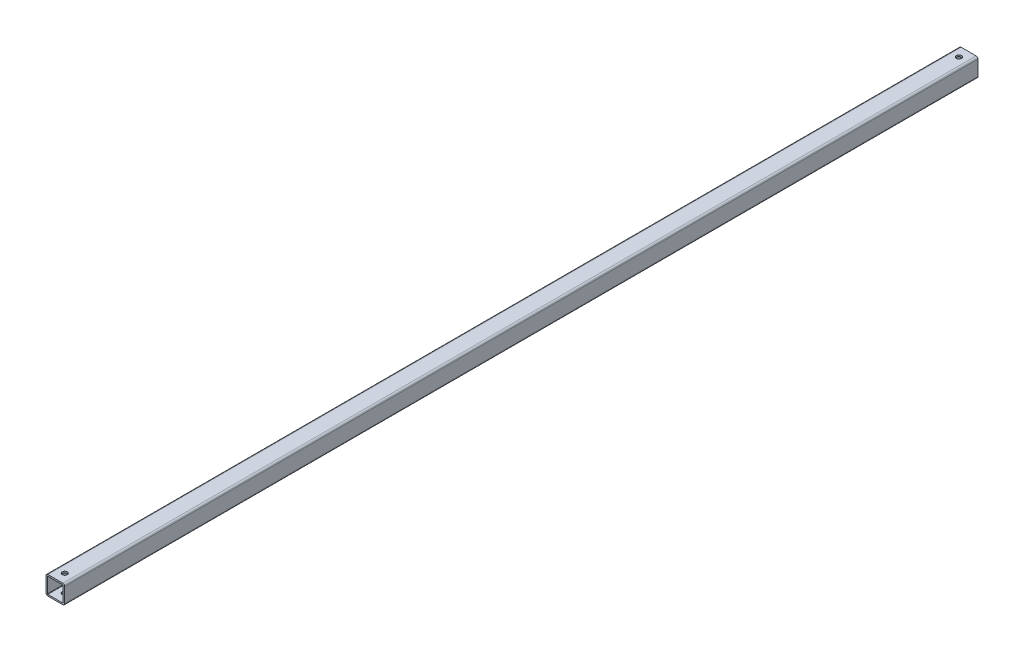
ISO-10303-21;
HEADER;
FILE_DESCRIPTION(('STEP AP214'),'2;1');
FILE_NAME('part.step','',(''),(''),'','','');
FILE_SCHEMA(('AUTOMOTIVE_DESIGN { 1 0 10303 214 1 1 1 1 }'));
ENDSEC;
DATA;
#1=APPLICATION_CONTEXT('core data for automotive mechanical design processes');
#2=APPLICATION_PROTOCOL_DEFINITION('international standard','automotive_design',2000,#1);
#3=PRODUCT_CONTEXT('',#1,'mechanical');
#4=PRODUCT('Part','Part','',(#3));
#5=PRODUCT_RELATED_PRODUCT_CATEGORY('part','',(#4));
#6=PRODUCT_DEFINITION_FORMATION('','',#4);
#7=PRODUCT_DEFINITION_CONTEXT('part definition',#1,'design');
#8=PRODUCT_DEFINITION('design','',#6,#7);
#9=PRODUCT_DEFINITION_SHAPE('','',#8);
#10=(LENGTH_UNIT() NAMED_UNIT(*) SI_UNIT(.MILLI.,.METRE.));
#11=(NAMED_UNIT(*) PLANE_ANGLE_UNIT() SI_UNIT($,.RADIAN.));
#12=(NAMED_UNIT(*) SI_UNIT($,.STERADIAN.) SOLID_ANGLE_UNIT());
#13=UNCERTAINTY_MEASURE_WITH_UNIT(LENGTH_MEASURE(1.E-05),#10,'distance_accuracy_value','');
#14=(GEOMETRIC_REPRESENTATION_CONTEXT(3) GLOBAL_UNCERTAINTY_ASSIGNED_CONTEXT((#13)) GLOBAL_UNIT_ASSIGNED_CONTEXT((#10,
#11,#12)) REPRESENTATION_CONTEXT('',''));
#15=CARTESIAN_POINT('',(0.,0.,0.));
#16=DIRECTION('',(0.,0.,1.));
#17=DIRECTION('',(1.,0.,0.));
#18=AXIS2_PLACEMENT_3D('',#15,#16,#17);
#19=CARTESIAN_POINT('',(-10.,10.,609.6));
#20=DIRECTION('',(0.,0.,1.));
#21=DIRECTION('',(1.,0.,0.));
#22=AXIS2_PLACEMENT_3D('',#19,#20,#21);
#23=PLANE('',#22);
#24=CARTESIAN_POINT('',(-10.,10.,609.6));
#25=DIRECTION('',(0.,0.,1.));
#26=DIRECTION('',(1.,0.,0.));
#27=AXIS2_PLACEMENT_3D('',#24,#25,#26);
#28=CIRCLE('',#27,2.5);
#29=CARTESIAN_POINT('',(-10.,12.5,609.6));
#30=VERTEX_POINT('',#29);
#31=CARTESIAN_POINT('',(-12.5,10.,609.6));
#32=VERTEX_POINT('',#31);
#33=EDGE_CURVE('E264',#30,#32,#28,.T.);
#34=ORIENTED_EDGE('',*,*,#33,.T.);
#35=DIRECTION('',(0.,-1.,0.));
#36=VECTOR('',#35,1.);
#37=CARTESIAN_POINT('',(-12.5,-10.,609.6));
#38=LINE('',#37,#36);
#39=CARTESIAN_POINT('',(-12.5,-10.,609.6));
#40=VERTEX_POINT('',#39);
#41=EDGE_CURVE('E267',#32,#40,#38,.T.);
#42=ORIENTED_EDGE('',*,*,#41,.T.);
#43=CARTESIAN_POINT('',(-10.,-10.,609.6));
#44=DIRECTION('',(0.,0.,1.));
#45=DIRECTION('',(-1.,0.,0.));
#46=AXIS2_PLACEMENT_3D('',#43,#44,#45);
#47=CIRCLE('',#46,2.5);
#48=CARTESIAN_POINT('',(-10.,-12.5,609.6));
#49=VERTEX_POINT('',#48);
#50=EDGE_CURVE('E270',#40,#49,#47,.T.);
#51=ORIENTED_EDGE('',*,*,#50,.T.);
#52=DIRECTION('',(1.,0.,0.));
#53=VECTOR('',#52,1.);
#54=CARTESIAN_POINT('',(10.,-12.5,609.6));
#55=LINE('',#54,#53);
#56=CARTESIAN_POINT('',(10.,-12.5,609.6));
#57=VERTEX_POINT('',#56);
#58=EDGE_CURVE('E272',#49,#57,#55,.T.);
#59=ORIENTED_EDGE('',*,*,#58,.T.);
#60=CARTESIAN_POINT('',(10.,-10.,609.6));
#61=DIRECTION('',(0.,0.,1.));
#62=DIRECTION('',(1.,0.,0.));
#63=AXIS2_PLACEMENT_3D('',#60,#61,#62);
#64=CIRCLE('',#63,2.5);
#65=CARTESIAN_POINT('',(12.5,-10.,609.6));
#66=VERTEX_POINT('',#65);
#67=EDGE_CURVE('E274',#57,#66,#64,.T.);
#68=ORIENTED_EDGE('',*,*,#67,.T.);
#69=DIRECTION('',(0.,1.,0.));
#70=VECTOR('',#69,1.);
#71=CARTESIAN_POINT('',(12.5,-10.,609.6));
#72=LINE('',#71,#70);
#73=CARTESIAN_POINT('',(12.5,10.,609.6));
#74=VERTEX_POINT('',#73);
#75=EDGE_CURVE('E276',#66,#74,#72,.T.);
#76=ORIENTED_EDGE('',*,*,#75,.T.);
#77=CARTESIAN_POINT('',(10.,10.,609.6));
#78=DIRECTION('',(0.,0.,1.));
#79=DIRECTION('',(1.,0.,0.));
#80=AXIS2_PLACEMENT_3D('',#77,#78,#79);
#81=CIRCLE('',#80,2.5);
#82=CARTESIAN_POINT('',(10.,12.5,609.6));
#83=VERTEX_POINT('',#82);
#84=EDGE_CURVE('E278',#74,#83,#81,.T.);
#85=ORIENTED_EDGE('',*,*,#84,.T.);
#86=DIRECTION('',(-1.,0.,0.));
#87=VECTOR('',#86,1.);
#88=CARTESIAN_POINT('',(10.,12.5,609.6));
#89=LINE('',#88,#87);
#90=EDGE_CURVE('E280',#83,#30,#89,.T.);
#91=ORIENTED_EDGE('',*,*,#90,.T.);
#92=EDGE_LOOP('',(#34,#42,#51,#59,#68,#76,#85,#91));
#93=FACE_BOUND('',#92,.T.);
#94=DIRECTION('',(0.,-1.,0.));
#95=VECTOR('',#94,1.);
#96=CARTESIAN_POINT('',(-10.5,-10.,609.6));
#97=LINE('',#96,#95);
#98=CARTESIAN_POINT('',(-10.5,10.,609.6));
#99=VERTEX_POINT('',#98);
#100=CARTESIAN_POINT('',(-10.5,-10.,609.6));
#101=VERTEX_POINT('',#100);
#102=EDGE_CURVE('E205',#99,#101,#97,.T.);
#103=ORIENTED_EDGE('',*,*,#102,.F.);
#104=CARTESIAN_POINT('',(-10.,10.,609.6));
#105=DIRECTION('',(0.,0.,1.));
#106=DIRECTION('',(1.,0.,0.));
#107=AXIS2_PLACEMENT_3D('',#104,#105,#106);
#108=CIRCLE('',#107,0.5);
#109=CARTESIAN_POINT('',(-10.,10.5,609.6));
#110=VERTEX_POINT('',#109);
#111=EDGE_CURVE('E197',#110,#99,#108,.T.);
#112=ORIENTED_EDGE('',*,*,#111,.F.);
#113=DIRECTION('',(-1.,0.,0.));
#114=VECTOR('',#113,1.);
#115=CARTESIAN_POINT('',(10.,10.5,609.6));
#116=LINE('',#115,#114);
#117=CARTESIAN_POINT('',(10.,10.5,609.6));
#118=VERTEX_POINT('',#117);
#119=EDGE_CURVE('E231',#118,#110,#116,.T.);
#120=ORIENTED_EDGE('',*,*,#119,.F.);
#121=CARTESIAN_POINT('',(10.,10.,609.6));
#122=DIRECTION('',(0.,0.,1.));
#123=DIRECTION('',(1.,0.,0.));
#124=AXIS2_PLACEMENT_3D('',#121,#122,#123);
#125=CIRCLE('',#124,0.499999999999997);
#126=CARTESIAN_POINT('',(10.5,10.,609.6));
#127=VERTEX_POINT('',#126);
#128=EDGE_CURVE('E229',#127,#118,#125,.T.);
#129=ORIENTED_EDGE('',*,*,#128,.F.);
#130=DIRECTION('',(0.,1.,0.));
#131=VECTOR('',#130,1.);
#132=CARTESIAN_POINT('',(10.5,-10.,609.6));
#133=LINE('',#132,#131);
#134=CARTESIAN_POINT('',(10.5,-10.,609.6));
#135=VERTEX_POINT('',#134);
#136=EDGE_CURVE('E227',#135,#127,#133,.T.);
#137=ORIENTED_EDGE('',*,*,#136,.F.);
#138=CARTESIAN_POINT('',(10.,-10.,609.6));
#139=DIRECTION('',(0.,0.,1.));
#140=DIRECTION('',(1.,0.,0.));
#141=AXIS2_PLACEMENT_3D('',#138,#139,#140);
#142=CIRCLE('',#141,0.499999999999999);
#143=CARTESIAN_POINT('',(10.,-10.5,609.6));
#144=VERTEX_POINT('',#143);
#145=EDGE_CURVE('E225',#144,#135,#142,.T.);
#146=ORIENTED_EDGE('',*,*,#145,.F.);
#147=DIRECTION('',(1.,0.,0.));
#148=VECTOR('',#147,1.);
#149=CARTESIAN_POINT('',(10.,-10.5,609.6));
#150=LINE('',#149,#148);
#151=CARTESIAN_POINT('',(-10.,-10.5,609.6));
#152=VERTEX_POINT('',#151);
#153=EDGE_CURVE('E220',#152,#144,#150,.T.);
#154=ORIENTED_EDGE('',*,*,#153,.F.);
#155=CARTESIAN_POINT('',(-10.,-10.,609.6));
#156=DIRECTION('',(0.,0.,1.));
#157=DIRECTION('',(1.,0.,0.));
#158=AXIS2_PLACEMENT_3D('',#155,#156,#157);
#159=CIRCLE('',#158,0.500000000000001);
#160=EDGE_CURVE('E218',#101,#152,#159,.T.);
#161=ORIENTED_EDGE('',*,*,#160,.F.);
#162=EDGE_LOOP('',(#103,#112,#120,#129,#137,#146,#154,#161));
#163=FACE_BOUND('',#162,.T.);
#164=ADVANCED_FACE('F82',(#93,#163),#23,.T.);
#165=CARTESIAN_POINT('',(-10.,10.,-609.6));
#166=DIRECTION('',(0.,0.,1.));
#167=DIRECTION('',(1.,0.,0.));
#168=AXIS2_PLACEMENT_3D('',#165,#166,#167);
#169=PLANE('',#168);
#170=CARTESIAN_POINT('',(-10.,10.,-609.6));
#171=DIRECTION('',(0.,0.,1.));
#172=DIRECTION('',(1.,0.,0.));
#173=AXIS2_PLACEMENT_3D('',#170,#171,#172);
#174=CIRCLE('',#173,2.5);
#175=CARTESIAN_POINT('',(-10.,12.5,-609.6));
#176=VERTEX_POINT('',#175);
#177=CARTESIAN_POINT('',(-12.5,10.,-609.6));
#178=VERTEX_POINT('',#177);
#179=EDGE_CURVE('E213',#176,#178,#174,.T.);
#180=ORIENTED_EDGE('',*,*,#179,.F.);
#181=DIRECTION('',(-1.,0.,0.));
#182=VECTOR('',#181,1.);
#183=CARTESIAN_POINT('',(10.,12.5,-609.6));
#184=LINE('',#183,#182);
#185=CARTESIAN_POINT('',(10.,12.5,-609.6));
#186=VERTEX_POINT('',#185);
#187=EDGE_CURVE('E268',#186,#176,#184,.T.);
#188=ORIENTED_EDGE('',*,*,#187,.F.);
#189=CARTESIAN_POINT('',(10.,10.,-609.6));
#190=DIRECTION('',(0.,0.,1.));
#191=DIRECTION('',(1.,0.,0.));
#192=AXIS2_PLACEMENT_3D('',#189,#190,#191);
#193=CIRCLE('',#192,2.5);
#194=CARTESIAN_POINT('',(12.5,10.,-609.6));
#195=VERTEX_POINT('',#194);
#196=EDGE_CURVE('E295',#195,#186,#193,.T.);
#197=ORIENTED_EDGE('',*,*,#196,.F.);
#198=DIRECTION('',(0.,1.,0.));
#199=VECTOR('',#198,1.);
#200=CARTESIAN_POINT('',(12.5,-10.,-609.6));
#201=LINE('',#200,#199);
#202=CARTESIAN_POINT('',(12.5,-10.,-609.6));
#203=VERTEX_POINT('',#202);
#204=EDGE_CURVE('E293',#203,#195,#201,.T.);
#205=ORIENTED_EDGE('',*,*,#204,.F.);
#206=CARTESIAN_POINT('',(10.,-10.,-609.6));
#207=DIRECTION('',(0.,0.,1.));
#208=DIRECTION('',(1.,0.,0.));
#209=AXIS2_PLACEMENT_3D('',#206,#207,#208);
#210=CIRCLE('',#209,2.5);
#211=CARTESIAN_POINT('',(10.,-12.5,-609.6));
#212=VERTEX_POINT('',#211);
#213=EDGE_CURVE('E291',#212,#203,#210,.T.);
#214=ORIENTED_EDGE('',*,*,#213,.F.);
#215=DIRECTION('',(1.,0.,0.));
#216=VECTOR('',#215,1.);
#217=CARTESIAN_POINT('',(10.,-12.5,-609.6));
#218=LINE('',#217,#216);
#219=CARTESIAN_POINT('',(-10.,-12.5,-609.6));
#220=VERTEX_POINT('',#219);
#221=EDGE_CURVE('E289',#220,#212,#218,.T.);
#222=ORIENTED_EDGE('',*,*,#221,.F.);
#223=CARTESIAN_POINT('',(-10.,-10.,-609.6));
#224=DIRECTION('',(0.,0.,1.));
#225=DIRECTION('',(-1.,0.,0.));
#226=AXIS2_PLACEMENT_3D('',#223,#224,#225);
#227=CIRCLE('',#226,2.5);
#228=CARTESIAN_POINT('',(-12.5,-10.,-609.6));
#229=VERTEX_POINT('',#228);
#230=EDGE_CURVE('E287',#229,#220,#227,.T.);
#231=ORIENTED_EDGE('',*,*,#230,.F.);
#232=DIRECTION('',(0.,-1.,0.));
#233=VECTOR('',#232,1.);
#234=CARTESIAN_POINT('',(-12.5,-10.,-609.6));
#235=LINE('',#234,#233);
#236=EDGE_CURVE('E285',#178,#229,#235,.T.);
#237=ORIENTED_EDGE('',*,*,#236,.F.);
#238=EDGE_LOOP('',(#180,#188,#197,#205,#214,#222,#231,#237));
#239=FACE_BOUND('',#238,.T.);
#240=CARTESIAN_POINT('',(-10.,10.,-609.6));
#241=DIRECTION('',(0.,0.,1.));
#242=DIRECTION('',(1.,0.,0.));
#243=AXIS2_PLACEMENT_3D('',#240,#241,#242);
#244=CIRCLE('',#243,0.5);
#245=CARTESIAN_POINT('',(-10.,10.5,-609.6));
#246=VERTEX_POINT('',#245);
#247=CARTESIAN_POINT('',(-10.5,10.,-609.6));
#248=VERTEX_POINT('',#247);
#249=EDGE_CURVE('E107',#246,#248,#244,.T.);
#250=ORIENTED_EDGE('',*,*,#249,.T.);
#251=DIRECTION('',(0.,-1.,0.));
#252=VECTOR('',#251,1.);
#253=CARTESIAN_POINT('',(-10.5,-10.,-609.6));
#254=LINE('',#253,#252);
#255=CARTESIAN_POINT('',(-10.5,-10.,-609.6));
#256=VERTEX_POINT('',#255);
#257=EDGE_CURVE('E212',#248,#256,#254,.T.);
#258=ORIENTED_EDGE('',*,*,#257,.T.);
#259=CARTESIAN_POINT('',(-10.,-10.,-609.6));
#260=DIRECTION('',(0.,0.,1.));
#261=DIRECTION('',(1.,0.,0.));
#262=AXIS2_PLACEMENT_3D('',#259,#260,#261);
#263=CIRCLE('',#262,0.500000000000001);
#264=CARTESIAN_POINT('',(-10.,-10.5,-609.6));
#265=VERTEX_POINT('',#264);
#266=EDGE_CURVE('E236',#256,#265,#263,.T.);
#267=ORIENTED_EDGE('',*,*,#266,.T.);
#268=DIRECTION('',(1.,0.,0.));
#269=VECTOR('',#268,1.);
#270=CARTESIAN_POINT('',(10.,-10.5,-609.6));
#271=LINE('',#270,#269);
#272=CARTESIAN_POINT('',(10.,-10.5,-609.6));
#273=VERTEX_POINT('',#272);
#274=EDGE_CURVE('E239',#265,#273,#271,.T.);
#275=ORIENTED_EDGE('',*,*,#274,.T.);
#276=CARTESIAN_POINT('',(10.,-10.,-609.6));
#277=DIRECTION('',(0.,0.,1.));
#278=DIRECTION('',(1.,0.,0.));
#279=AXIS2_PLACEMENT_3D('',#276,#277,#278);
#280=CIRCLE('',#279,0.499999999999999);
#281=CARTESIAN_POINT('',(10.5,-10.,-609.6));
#282=VERTEX_POINT('',#281);
#283=EDGE_CURVE('E242',#273,#282,#280,.T.);
#284=ORIENTED_EDGE('',*,*,#283,.T.);
#285=DIRECTION('',(0.,1.,0.));
#286=VECTOR('',#285,1.);
#287=CARTESIAN_POINT('',(10.5,-10.,-609.6));
#288=LINE('',#287,#286);
#289=CARTESIAN_POINT('',(10.5,10.,-609.6));
#290=VERTEX_POINT('',#289);
#291=EDGE_CURVE('E245',#282,#290,#288,.T.);
#292=ORIENTED_EDGE('',*,*,#291,.T.);
#293=CARTESIAN_POINT('',(10.,10.,-609.6));
#294=DIRECTION('',(0.,0.,1.));
#295=DIRECTION('',(1.,0.,0.));
#296=AXIS2_PLACEMENT_3D('',#293,#294,#295);
#297=CIRCLE('',#296,0.499999999999997);
#298=CARTESIAN_POINT('',(10.,10.5,-609.6));
#299=VERTEX_POINT('',#298);
#300=EDGE_CURVE('E248',#290,#299,#297,.T.);
#301=ORIENTED_EDGE('',*,*,#300,.T.);
#302=DIRECTION('',(-1.,0.,0.));
#303=VECTOR('',#302,1.);
#304=CARTESIAN_POINT('',(10.,10.5,-609.6));
#305=LINE('',#304,#303);
#306=EDGE_CURVE('E206',#299,#246,#305,.T.);
#307=ORIENTED_EDGE('',*,*,#306,.T.);
#308=EDGE_LOOP('',(#250,#258,#267,#275,#284,#292,#301,#307));
#309=FACE_BOUND('',#308,.T.);
#310=ADVANCED_FACE('F355',(#239,#309),#169,.F.);
#311=CARTESIAN_POINT('',(-10.,10.,609.6));
#312=DIRECTION('',(0.,0.,-1.));
#313=DIRECTION('',(-1.,0.,0.));
#314=AXIS2_PLACEMENT_3D('',#311,#312,#313);
#315=CYLINDRICAL_SURFACE('',#314,2.5);
#316=ORIENTED_EDGE('',*,*,#179,.T.);
#317=DIRECTION('',(0.,0.,-1.));
#318=VECTOR('',#317,1.);
#319=CARTESIAN_POINT('',(-12.5,10.,609.6));
#320=LINE('',#319,#318);
#321=EDGE_CURVE('E12',#32,#178,#320,.T.);
#322=ORIENTED_EDGE('',*,*,#321,.F.);
#323=ORIENTED_EDGE('',*,*,#33,.F.);
#324=DIRECTION('',(0.,0.,-1.));
#325=VECTOR('',#324,1.);
#326=CARTESIAN_POINT('',(-10.,12.5,609.6));
#327=LINE('',#326,#325);
#328=EDGE_CURVE('E282',#30,#176,#327,.T.);
#329=ORIENTED_EDGE('',*,*,#328,.T.);
#330=EDGE_LOOP('',(#316,#322,#323,#329));
#331=FACE_BOUND('',#330,.T.);
#332=ADVANCED_FACE('F84',(#331),#315,.T.);
#333=CARTESIAN_POINT('',(-12.5,-10.,609.6));
#334=DIRECTION('',(1.,0.,0.));
#335=DIRECTION('',(0.,0.,-1.));
#336=AXIS2_PLACEMENT_3D('',#333,#334,#335);
#337=PLANE('',#336);
#338=ORIENTED_EDGE('',*,*,#236,.T.);
#339=DIRECTION('',(0.,0.,-1.));
#340=VECTOR('',#339,1.);
#341=CARTESIAN_POINT('',(-12.5,-10.,609.6));
#342=LINE('',#341,#340);
#343=EDGE_CURVE('E91',#40,#229,#342,.T.);
#344=ORIENTED_EDGE('',*,*,#343,.F.);
#345=ORIENTED_EDGE('',*,*,#41,.F.);
#346=ORIENTED_EDGE('',*,*,#321,.T.);
#347=EDGE_LOOP('',(#338,#344,#345,#346));
#348=FACE_BOUND('',#347,.T.);
#349=ADVANCED_FACE('F387',(#348),#337,.F.);
#350=CARTESIAN_POINT('',(-10.,-10.,609.6));
#351=DIRECTION('',(0.,0.,-1.));
#352=DIRECTION('',(-1.,0.,0.));
#353=AXIS2_PLACEMENT_3D('',#350,#351,#352);
#354=CYLINDRICAL_SURFACE('',#353,2.5);
#355=ORIENTED_EDGE('',*,*,#230,.T.);
#356=DIRECTION('',(0.,0.,-1.));
#357=VECTOR('',#356,1.);
#358=CARTESIAN_POINT('',(-10.,-12.5,609.6));
#359=LINE('',#358,#357);
#360=EDGE_CURVE('E312',#49,#220,#359,.T.);
#361=ORIENTED_EDGE('',*,*,#360,.F.);
#362=ORIENTED_EDGE('',*,*,#50,.F.);
#363=ORIENTED_EDGE('',*,*,#343,.T.);
#364=EDGE_LOOP('',(#355,#361,#362,#363));
#365=FACE_BOUND('',#364,.T.);
#366=ADVANCED_FACE('F384',(#365),#354,.T.);
#367=CARTESIAN_POINT('',(10.,-12.5,609.6));
#368=DIRECTION('',(0.,1.,0.));
#369=DIRECTION('',(-1.,0.,0.));
#370=AXIS2_PLACEMENT_3D('',#367,#368,#369);
#371=PLANE('',#370);
#372=CARTESIAN_POINT('',(-0.200000000000002,-12.5,-596.9));
#373=DIRECTION('',(0.,1.,0.));
#374=DIRECTION('',(-1.,0.,0.));
#375=AXIS2_PLACEMENT_3D('',#372,#373,#374);
#376=CIRCLE('',#375,3.3782);
#377=CARTESIAN_POINT('',(-0.200000000000002,-12.5,-593.5218));
#378=VERTEX_POINT('',#377);
#379=EDGE_CURVE('E325',#378,#378,#376,.T.);
#380=ORIENTED_EDGE('',*,*,#379,.T.);
#381=EDGE_LOOP('',(#380));
#382=FACE_BOUND('',#381,.T.);
#383=CARTESIAN_POINT('',(-0.200000000000002,-12.5,596.9));
#384=DIRECTION('',(0.,1.,0.));
#385=DIRECTION('',(-1.,0.,0.));
#386=AXIS2_PLACEMENT_3D('',#383,#384,#385);
#387=CIRCLE('',#386,3.3782);
#388=CARTESIAN_POINT('',(-0.200000000000002,-12.5,600.2782));
#389=VERTEX_POINT('',#388);
#390=EDGE_CURVE('E234',#389,#389,#387,.T.);
#391=ORIENTED_EDGE('',*,*,#390,.T.);
#392=EDGE_LOOP('',(#391));
#393=FACE_BOUND('',#392,.T.);
#394=ORIENTED_EDGE('',*,*,#221,.T.);
#395=DIRECTION('',(0.,0.,-1.));
#396=VECTOR('',#395,1.);
#397=CARTESIAN_POINT('',(10.,-12.5,609.6));
#398=LINE('',#397,#396);
#399=EDGE_CURVE('E309',#57,#212,#398,.T.);
#400=ORIENTED_EDGE('',*,*,#399,.F.);
#401=ORIENTED_EDGE('',*,*,#58,.F.);
#402=ORIENTED_EDGE('',*,*,#360,.T.);
#403=EDGE_LOOP('',(#394,#400,#401,#402));
#404=FACE_BOUND('',#403,.T.);
#405=ADVANCED_FACE('F336',(#382,#393,#404),#371,.F.);
#406=CARTESIAN_POINT('',(10.,-10.,609.6));
#407=DIRECTION('',(0.,0.,-1.));
#408=DIRECTION('',(-1.,0.,0.));
#409=AXIS2_PLACEMENT_3D('',#406,#407,#408);
#410=CYLINDRICAL_SURFACE('',#409,2.5);
#411=ORIENTED_EDGE('',*,*,#213,.T.);
#412=DIRECTION('',(0.,0.,-1.));
#413=VECTOR('',#412,1.);
#414=CARTESIAN_POINT('',(12.5,-10.,609.6));
#415=LINE('',#414,#413);
#416=EDGE_CURVE('E306',#66,#203,#415,.T.);
#417=ORIENTED_EDGE('',*,*,#416,.F.);
#418=ORIENTED_EDGE('',*,*,#67,.F.);
#419=ORIENTED_EDGE('',*,*,#399,.T.);
#420=EDGE_LOOP('',(#411,#417,#418,#419));
#421=FACE_BOUND('',#420,.T.);
#422=ADVANCED_FACE('F377',(#421),#410,.T.);
#423=CARTESIAN_POINT('',(12.5,-10.,609.6));
#424=DIRECTION('',(-1.,0.,0.));
#425=DIRECTION('',(0.,-1.,0.));
#426=AXIS2_PLACEMENT_3D('',#423,#424,#425);
#427=PLANE('',#426);
#428=ORIENTED_EDGE('',*,*,#204,.T.);
#429=DIRECTION('',(0.,0.,-1.));
#430=VECTOR('',#429,1.);
#431=CARTESIAN_POINT('',(12.5,10.,609.6));
#432=LINE('',#431,#430);
#433=EDGE_CURVE('E303',#74,#195,#432,.T.);
#434=ORIENTED_EDGE('',*,*,#433,.F.);
#435=ORIENTED_EDGE('',*,*,#75,.F.);
#436=ORIENTED_EDGE('',*,*,#416,.T.);
#437=EDGE_LOOP('',(#428,#434,#435,#436));
#438=FACE_BOUND('',#437,.T.);
#439=ADVANCED_FACE('F373',(#438),#427,.F.);
#440=CARTESIAN_POINT('',(10.,10.,609.6));
#441=DIRECTION('',(0.,0.,-1.));
#442=DIRECTION('',(-1.,0.,0.));
#443=AXIS2_PLACEMENT_3D('',#440,#441,#442);
#444=CYLINDRICAL_SURFACE('',#443,2.5);
#445=ORIENTED_EDGE('',*,*,#196,.T.);
#446=DIRECTION('',(0.,0.,-1.));
#447=VECTOR('',#446,1.);
#448=CARTESIAN_POINT('',(10.,12.5,609.6));
#449=LINE('',#448,#447);
#450=EDGE_CURVE('E300',#83,#186,#449,.T.);
#451=ORIENTED_EDGE('',*,*,#450,.F.);
#452=ORIENTED_EDGE('',*,*,#84,.F.);
#453=ORIENTED_EDGE('',*,*,#433,.T.);
#454=EDGE_LOOP('',(#445,#451,#452,#453));
#455=FACE_BOUND('',#454,.T.);
#456=ADVANCED_FACE('F369',(#455),#444,.T.);
#457=CARTESIAN_POINT('',(10.,12.5,609.6));
#458=DIRECTION('',(0.,-1.,0.));
#459=DIRECTION('',(1.,0.,0.));
#460=AXIS2_PLACEMENT_3D('',#457,#458,#459);
#461=PLANE('',#460);
#462=CARTESIAN_POINT('',(-0.200000000000002,12.5,-596.9));
#463=DIRECTION('',(0.,1.,0.));
#464=DIRECTION('',(0.,0.,1.));
#465=AXIS2_PLACEMENT_3D('',#462,#463,#464);
#466=CIRCLE('',#465,3.3782);
#467=CARTESIAN_POINT('',(-0.200000000000002,12.5,-593.5218));
#468=VERTEX_POINT('',#467);
#469=EDGE_CURVE('E464',#468,#468,#466,.T.);
#470=ORIENTED_EDGE('',*,*,#469,.F.);
#471=EDGE_LOOP('',(#470));
#472=FACE_BOUND('',#471,.T.);
#473=CARTESIAN_POINT('',(-0.200000000000002,12.5,596.9));
#474=DIRECTION('',(0.,1.,0.));
#475=DIRECTION('',(0.,0.,1.));
#476=AXIS2_PLACEMENT_3D('',#473,#474,#475);
#477=CIRCLE('',#476,3.3782);
#478=CARTESIAN_POINT('',(-0.200000000000002,12.5,600.2782));
#479=VERTEX_POINT('',#478);
#480=EDGE_CURVE('E319',#479,#479,#477,.T.);
#481=ORIENTED_EDGE('',*,*,#480,.F.);
#482=EDGE_LOOP('',(#481));
#483=FACE_BOUND('',#482,.T.);
#484=ORIENTED_EDGE('',*,*,#187,.T.);
#485=ORIENTED_EDGE('',*,*,#328,.F.);
#486=ORIENTED_EDGE('',*,*,#90,.F.);
#487=ORIENTED_EDGE('',*,*,#450,.T.);
#488=EDGE_LOOP('',(#484,#485,#486,#487));
#489=FACE_BOUND('',#488,.T.);
#490=ADVANCED_FACE('F366',(#472,#483,#489),#461,.F.);
#491=CARTESIAN_POINT('',(-10.,10.,609.6));
#492=DIRECTION('',(0.,0.,-1.));
#493=DIRECTION('',(-1.,0.,0.));
#494=AXIS2_PLACEMENT_3D('',#491,#492,#493);
#495=CYLINDRICAL_SURFACE('',#494,0.5);
#496=ORIENTED_EDGE('',*,*,#249,.F.);
#497=DIRECTION('',(0.,0.,-1.));
#498=VECTOR('',#497,1.);
#499=CARTESIAN_POINT('',(-10.,10.5,609.6));
#500=LINE('',#499,#498);
#501=EDGE_CURVE('E201',#110,#246,#500,.T.);
#502=ORIENTED_EDGE('',*,*,#501,.F.);
#503=ORIENTED_EDGE('',*,*,#111,.T.);
#504=DIRECTION('',(0.,0.,-1.));
#505=VECTOR('',#504,1.);
#506=CARTESIAN_POINT('',(-10.5,10.,609.6));
#507=LINE('',#506,#505);
#508=EDGE_CURVE('E200',#99,#248,#507,.T.);
#509=ORIENTED_EDGE('',*,*,#508,.T.);
#510=EDGE_LOOP('',(#496,#502,#503,#509));
#511=FACE_BOUND('',#510,.T.);
#512=ADVANCED_FACE('F199',(#511),#495,.F.);
#513=CARTESIAN_POINT('',(-10.5,-10.,609.6));
#514=DIRECTION('',(1.,0.,0.));
#515=DIRECTION('',(0.,0.,-1.));
#516=AXIS2_PLACEMENT_3D('',#513,#514,#515);
#517=PLANE('',#516);
#518=ORIENTED_EDGE('',*,*,#257,.F.);
#519=ORIENTED_EDGE('',*,*,#508,.F.);
#520=ORIENTED_EDGE('',*,*,#102,.T.);
#521=DIRECTION('',(0.,0.,-1.));
#522=VECTOR('',#521,1.);
#523=CARTESIAN_POINT('',(-10.5,-10.,609.6));
#524=LINE('',#523,#522);
#525=EDGE_CURVE('E214',#101,#256,#524,.T.);
#526=ORIENTED_EDGE('',*,*,#525,.T.);
#527=EDGE_LOOP('',(#518,#519,#520,#526));
#528=FACE_BOUND('',#527,.T.);
#529=ADVANCED_FACE('F209',(#528),#517,.T.);
#530=CARTESIAN_POINT('',(-10.,-10.,609.6));
#531=DIRECTION('',(0.,0.,-1.));
#532=DIRECTION('',(-1.,0.,0.));
#533=AXIS2_PLACEMENT_3D('',#530,#531,#532);
#534=CYLINDRICAL_SURFACE('',#533,0.500000000000001);
#535=ORIENTED_EDGE('',*,*,#266,.F.);
#536=ORIENTED_EDGE('',*,*,#525,.F.);
#537=ORIENTED_EDGE('',*,*,#160,.T.);
#538=DIRECTION('',(0.,0.,-1.));
#539=VECTOR('',#538,1.);
#540=CARTESIAN_POINT('',(-10.,-10.5,609.6));
#541=LINE('',#540,#539);
#542=EDGE_CURVE('E261',#152,#265,#541,.T.);
#543=ORIENTED_EDGE('',*,*,#542,.T.);
#544=EDGE_LOOP('',(#535,#536,#537,#543));
#545=FACE_BOUND('',#544,.T.);
#546=ADVANCED_FACE('F440',(#545),#534,.F.);
#547=CARTESIAN_POINT('',(10.,-10.5,609.6));
#548=DIRECTION('',(0.,1.,0.));
#549=DIRECTION('',(-1.,0.,0.));
#550=AXIS2_PLACEMENT_3D('',#547,#548,#549);
#551=PLANE('',#550);
#552=CARTESIAN_POINT('',(-0.200000000000002,-10.5,-596.9));
#553=DIRECTION('',(0.,1.,0.));
#554=DIRECTION('',(-1.,0.,0.));
#555=AXIS2_PLACEMENT_3D('',#552,#553,#554);
#556=CIRCLE('',#555,3.3782);
#557=CARTESIAN_POINT('',(-0.200000000000002,-10.5,-593.5218));
#558=VERTEX_POINT('',#557);
#559=EDGE_CURVE('E86',#558,#558,#556,.T.);
#560=ORIENTED_EDGE('',*,*,#559,.F.);
#561=EDGE_LOOP('',(#560));
#562=FACE_BOUND('',#561,.T.);
#563=CARTESIAN_POINT('',(-0.200000000000002,-10.5,596.9));
#564=DIRECTION('',(0.,1.,0.));
#565=DIRECTION('',(-1.,0.,0.));
#566=AXIS2_PLACEMENT_3D('',#563,#564,#565);
#567=CIRCLE('',#566,3.3782);
#568=CARTESIAN_POINT('',(-0.200000000000002,-10.5,600.2782));
#569=VERTEX_POINT('',#568);
#570=EDGE_CURVE('E318',#569,#569,#567,.T.);
#571=ORIENTED_EDGE('',*,*,#570,.F.);
#572=EDGE_LOOP('',(#571));
#573=FACE_BOUND('',#572,.T.);
#574=ORIENTED_EDGE('',*,*,#274,.F.);
#575=ORIENTED_EDGE('',*,*,#542,.F.);
#576=ORIENTED_EDGE('',*,*,#153,.T.);
#577=DIRECTION('',(0.,0.,-1.));
#578=VECTOR('',#577,1.);
#579=CARTESIAN_POINT('',(10.,-10.5,609.6));
#580=LINE('',#579,#578);
#581=EDGE_CURVE('E259',#144,#273,#580,.T.);
#582=ORIENTED_EDGE('',*,*,#581,.T.);
#583=EDGE_LOOP('',(#574,#575,#576,#582));
#584=FACE_BOUND('',#583,.T.);
#585=ADVANCED_FACE('F437',(#562,#573,#584),#551,.T.);
#586=CARTESIAN_POINT('',(10.,-10.,609.6));
#587=DIRECTION('',(0.,0.,-1.));
#588=DIRECTION('',(-1.,0.,0.));
#589=AXIS2_PLACEMENT_3D('',#586,#587,#588);
#590=CYLINDRICAL_SURFACE('',#589,0.499999999999999);
#591=ORIENTED_EDGE('',*,*,#283,.F.);
#592=ORIENTED_EDGE('',*,*,#581,.F.);
#593=ORIENTED_EDGE('',*,*,#145,.T.);
#594=DIRECTION('',(0.,0.,-1.));
#595=VECTOR('',#594,1.);
#596=CARTESIAN_POINT('',(10.5,-10.,609.6));
#597=LINE('',#596,#595);
#598=EDGE_CURVE('E257',#135,#282,#597,.T.);
#599=ORIENTED_EDGE('',*,*,#598,.T.);
#600=EDGE_LOOP('',(#591,#592,#593,#599));
#601=FACE_BOUND('',#600,.T.);
#602=ADVANCED_FACE('F432',(#601),#590,.F.);
#603=CARTESIAN_POINT('',(10.5,-10.,609.6));
#604=DIRECTION('',(-1.,0.,0.));
#605=DIRECTION('',(0.,-1.,0.));
#606=AXIS2_PLACEMENT_3D('',#603,#604,#605);
#607=PLANE('',#606);
#608=ORIENTED_EDGE('',*,*,#291,.F.);
#609=ORIENTED_EDGE('',*,*,#598,.F.);
#610=ORIENTED_EDGE('',*,*,#136,.T.);
#611=DIRECTION('',(0.,0.,-1.));
#612=VECTOR('',#611,1.);
#613=CARTESIAN_POINT('',(10.5,10.,609.6));
#614=LINE('',#613,#612);
#615=EDGE_CURVE('E255',#127,#290,#614,.T.);
#616=ORIENTED_EDGE('',*,*,#615,.T.);
#617=EDGE_LOOP('',(#608,#609,#610,#616));
#618=FACE_BOUND('',#617,.T.);
#619=ADVANCED_FACE('F428',(#618),#607,.T.);
#620=CARTESIAN_POINT('',(10.,10.,609.6));
#621=DIRECTION('',(0.,0.,-1.));
#622=DIRECTION('',(-1.,0.,0.));
#623=AXIS2_PLACEMENT_3D('',#620,#621,#622);
#624=CYLINDRICAL_SURFACE('',#623,0.499999999999997);
#625=ORIENTED_EDGE('',*,*,#300,.F.);
#626=ORIENTED_EDGE('',*,*,#615,.F.);
#627=ORIENTED_EDGE('',*,*,#128,.T.);
#628=DIRECTION('',(0.,0.,-1.));
#629=VECTOR('',#628,1.);
#630=CARTESIAN_POINT('',(10.,10.5,609.6));
#631=LINE('',#630,#629);
#632=EDGE_CURVE('E99',#118,#299,#631,.T.);
#633=ORIENTED_EDGE('',*,*,#632,.T.);
#634=EDGE_LOOP('',(#625,#626,#627,#633));
#635=FACE_BOUND('',#634,.T.);
#636=ADVANCED_FACE('F425',(#635),#624,.F.);
#637=CARTESIAN_POINT('',(10.,10.5,609.6));
#638=DIRECTION('',(0.,-1.,0.));
#639=DIRECTION('',(1.,0.,0.));
#640=AXIS2_PLACEMENT_3D('',#637,#638,#639);
#641=PLANE('',#640);
#642=CARTESIAN_POINT('',(-0.200000000000002,10.5,-596.9));
#643=DIRECTION('',(0.,-1.,0.));
#644=DIRECTION('',(1.,0.,0.));
#645=AXIS2_PLACEMENT_3D('',#642,#643,#644);
#646=CIRCLE('',#645,3.3782);
#647=CARTESIAN_POINT('',(3.17819999999999,10.5,-596.9));
#648=VERTEX_POINT('',#647);
#649=EDGE_CURVE('E330',#648,#648,#646,.T.);
#650=ORIENTED_EDGE('',*,*,#649,.F.);
#651=EDGE_LOOP('',(#650));
#652=FACE_BOUND('',#651,.T.);
#653=CARTESIAN_POINT('',(-0.200000000000002,10.5,596.9));
#654=DIRECTION('',(0.,-1.,0.));
#655=DIRECTION('',(1.,0.,0.));
#656=AXIS2_PLACEMENT_3D('',#653,#654,#655);
#657=CIRCLE('',#656,3.3782);
#658=CARTESIAN_POINT('',(3.17819999999999,10.5,596.9));
#659=VERTEX_POINT('',#658);
#660=EDGE_CURVE('E316',#659,#659,#657,.T.);
#661=ORIENTED_EDGE('',*,*,#660,.F.);
#662=EDGE_LOOP('',(#661));
#663=FACE_BOUND('',#662,.T.);
#664=ORIENTED_EDGE('',*,*,#306,.F.);
#665=ORIENTED_EDGE('',*,*,#632,.F.);
#666=ORIENTED_EDGE('',*,*,#119,.T.);
#667=ORIENTED_EDGE('',*,*,#501,.T.);
#668=EDGE_LOOP('',(#664,#665,#666,#667));
#669=FACE_BOUND('',#668,.T.);
#670=ADVANCED_FACE('F352',(#652,#663,#669),#641,.T.);
#671=CARTESIAN_POINT('',(-0.200000000000002,12.5,596.9));
#672=DIRECTION('',(0.,1.,0.));
#673=DIRECTION('',(0.,0.,1.));
#674=AXIS2_PLACEMENT_3D('',#671,#672,#673);
#675=CYLINDRICAL_SURFACE('',#674,3.3782);
#676=ORIENTED_EDGE('',*,*,#660,.T.);
#677=EDGE_LOOP('',(#676));
#678=FACE_BOUND('',#677,.T.);
#679=ORIENTED_EDGE('',*,*,#480,.T.);
#680=EDGE_LOOP('',(#679));
#681=FACE_BOUND('',#680,.T.);
#682=ADVANCED_FACE('F342',(#678,#681),#675,.F.);
#683=CARTESIAN_POINT('',(-0.200000000000002,-10.5,600.2782));
#684=CARTESIAN_POINT('',(-0.200000000000002,-10.5208333333333,600.2782));
#685=CARTESIAN_POINT('',(-0.200000000000002,-10.5416666666667,600.2782));
#686=CARTESIAN_POINT('',(-0.200000000000002,-10.5833333333333,600.2782));
#687=CARTESIAN_POINT('',(-0.200000000000002,-10.6041666666667,600.2782));
#688=CARTESIAN_POINT('',(-0.200000000000002,-10.6458333333333,600.2782));
#689=CARTESIAN_POINT('',(-0.200000000000002,-10.6666666666667,600.2782));
#690=CARTESIAN_POINT('',(-0.200000000000002,-10.7083333333333,600.2782));
#691=CARTESIAN_POINT('',(-0.200000000000002,-10.7291666666667,600.2782));
#692=CARTESIAN_POINT('',(-0.200000000000002,-10.7708333333333,600.2782));
#693=CARTESIAN_POINT('',(-0.200000000000002,-10.7916666666667,600.2782));
#694=CARTESIAN_POINT('',(-0.200000000000002,-10.8333333333333,600.2782));
#695=CARTESIAN_POINT('',(-0.200000000000002,-10.8541666666667,600.2782));
#696=CARTESIAN_POINT('',(-0.200000000000002,-10.8958333333333,600.2782));
#697=CARTESIAN_POINT('',(-0.200000000000002,-10.9166666666667,600.2782));
#698=CARTESIAN_POINT('',(-0.200000000000002,-10.9583333333333,600.2782));
#699=CARTESIAN_POINT('',(-0.200000000000002,-10.9791666666667,600.2782));
#700=CARTESIAN_POINT('',(-0.200000000000002,-11.0208333333333,600.2782));
#701=CARTESIAN_POINT('',(-0.200000000000002,-11.0416666666667,600.2782));
#702=CARTESIAN_POINT('',(-0.200000000000002,-11.0833333333333,600.2782));
#703=CARTESIAN_POINT('',(-0.200000000000002,-11.1041666666667,600.2782));
#704=CARTESIAN_POINT('',(-0.200000000000002,-11.1458333333333,600.2782));
#705=CARTESIAN_POINT('',(-0.200000000000002,-11.1666666666667,600.2782));
#706=CARTESIAN_POINT('',(-0.200000000000002,-11.2083333333333,600.2782));
#707=CARTESIAN_POINT('',(-0.200000000000002,-11.2291666666667,600.2782));
#708=CARTESIAN_POINT('',(-0.200000000000002,-11.2708333333333,600.2782));
#709=CARTESIAN_POINT('',(-0.200000000000002,-11.2916666666667,600.2782));
#710=CARTESIAN_POINT('',(-0.200000000000002,-11.3333333333333,600.2782));
#711=CARTESIAN_POINT('',(-0.200000000000002,-11.3541666666667,600.2782));
#712=CARTESIAN_POINT('',(-0.200000000000002,-11.3958333333333,600.2782));
#713=CARTESIAN_POINT('',(-0.200000000000002,-11.4166666666667,600.2782));
#714=CARTESIAN_POINT('',(-0.200000000000002,-11.4583333333333,600.2782));
#715=CARTESIAN_POINT('',(-0.200000000000002,-11.4791666666667,600.2782));
#716=CARTESIAN_POINT('',(-0.200000000000002,-11.5208333333333,600.2782));
#717=CARTESIAN_POINT('',(-0.200000000000002,-11.5416666666667,600.2782));
#718=CARTESIAN_POINT('',(-0.200000000000002,-11.5833333333333,600.2782));
#719=CARTESIAN_POINT('',(-0.200000000000002,-11.6041666666667,600.2782));
#720=CARTESIAN_POINT('',(-0.200000000000002,-11.6458333333333,600.2782));
#721=CARTESIAN_POINT('',(-0.200000000000002,-11.6666666666667,600.2782));
#722=CARTESIAN_POINT('',(-0.200000000000002,-11.7083333333333,600.2782));
#723=CARTESIAN_POINT('',(-0.200000000000002,-11.7291666666667,600.2782));
#724=CARTESIAN_POINT('',(-0.200000000000002,-11.7708333333333,600.2782));
#725=CARTESIAN_POINT('',(-0.200000000000002,-11.7916666666667,600.2782));
#726=CARTESIAN_POINT('',(-0.200000000000002,-11.8333333333333,600.2782));
#727=CARTESIAN_POINT('',(-0.200000000000002,-11.8541666666667,600.2782));
#728=CARTESIAN_POINT('',(-0.200000000000002,-11.8958333333333,600.2782));
#729=CARTESIAN_POINT('',(-0.200000000000002,-11.9166666666667,600.2782));
#730=CARTESIAN_POINT('',(-0.200000000000002,-11.9583333333333,600.2782));
#731=CARTESIAN_POINT('',(-0.200000000000002,-11.9791666666667,600.2782));
#732=CARTESIAN_POINT('',(-0.200000000000002,-12.0208333333333,600.2782));
#733=CARTESIAN_POINT('',(-0.200000000000002,-12.0416666666667,600.2782));
#734=CARTESIAN_POINT('',(-0.200000000000002,-12.0833333333333,600.2782));
#735=CARTESIAN_POINT('',(-0.200000000000002,-12.1041666666667,600.2782));
#736=CARTESIAN_POINT('',(-0.200000000000002,-12.1458333333333,600.2782));
#737=CARTESIAN_POINT('',(-0.200000000000002,-12.1666666666667,600.2782));
#738=CARTESIAN_POINT('',(-0.200000000000002,-12.2083333333333,600.2782));
#739=CARTESIAN_POINT('',(-0.200000000000002,-12.2291666666667,600.2782));
#740=CARTESIAN_POINT('',(-0.200000000000002,-12.2708333333333,600.2782));
#741=CARTESIAN_POINT('',(-0.200000000000002,-12.2916666666667,600.2782));
#742=CARTESIAN_POINT('',(-0.200000000000002,-12.3333333333333,600.2782));
#743=CARTESIAN_POINT('',(-0.200000000000002,-12.3541666666667,600.2782));
#744=CARTESIAN_POINT('',(-0.200000000000002,-12.3958333333333,600.2782));
#745=CARTESIAN_POINT('',(-0.200000000000002,-12.4166666666667,600.2782));
#746=CARTESIAN_POINT('',(-0.200000000000002,-12.4583333333333,600.2782));
#747=CARTESIAN_POINT('',(-0.200000000000002,-12.4791666666667,600.2782));
#748=CARTESIAN_POINT('',(-0.200000000000002,-12.5,600.2782));
#749=B_SPLINE_CURVE_WITH_KNOTS('',3,(#683,#684,#685,#686,#687,#688,#689,#690,#691,#692,#693,
#694,#695,#696,#697,#698,#699,#700,#701,#702,#703,#704,#705,#706,#707,#708,#709,#710,#711,#712,
#713,#714,#715,#716,#717,#718,#719,#720,#721,#722,#723,#724,#725,#726,#727,#728,#729,#730,#731,
#732,#733,#734,#735,#736,#737,#738,#739,#740,#741,#742,#743,#744,#745,#746,#747,#748),
.UNSPECIFIED.,.F.,.F.,(4,2,2,2,2,2,2,2,2,2,2,2,2,2,2,2,2,2,2,2,2,2,2,2,2,2,2,2,2,2,2,2,4),(0.,
0.0625000000000001,0.125,0.1875,0.25,0.3125,0.375,0.4375,0.5,0.562499999999997,
0.624999999999997,0.687499999999997,0.749999999999997,0.812499999999997,0.874999999999997,
0.937499999999997,0.999999999999997,1.0625,1.125,1.1875,1.25,1.3125,1.375,1.4375,
1.49999999999999,1.56249999999999,1.62499999999999,1.68749999999999,1.74999999999999,
1.81249999999999,1.87499999999999,1.93749999999999,1.99999999999999),.UNSPECIFIED.);
#750=EDGE_CURVE('BSEAM339',#569,#389,#749,.T.);
#751=ORIENTED_EDGE('',*,*,#570,.T.);
#752=ORIENTED_EDGE('',*,*,#390,.F.);
#753=ORIENTED_EDGE('',*,*,#750,.T.);
#754=ORIENTED_EDGE('',*,*,#750,.F.);
#755=EDGE_LOOP('',(#751,#753,#752,#754));
#756=FACE_BOUND('',#755,.T.);
#757=ADVANCED_FACE('F339',(#756),#675,.F.);
#758=CARTESIAN_POINT('',(-0.200000000000002,12.5,-596.9));
#759=DIRECTION('',(0.,1.,0.));
#760=DIRECTION('',(0.,0.,1.));
#761=AXIS2_PLACEMENT_3D('',#758,#759,#760);
#762=CYLINDRICAL_SURFACE('',#761,3.3782);
#763=CARTESIAN_POINT('',(-0.200000000000002,-10.5,-593.5218));
#764=CARTESIAN_POINT('',(-0.200000000000002,-10.5208333333333,-593.5218));
#765=CARTESIAN_POINT('',(-0.200000000000002,-10.5416666666667,-593.5218));
#766=CARTESIAN_POINT('',(-0.200000000000002,-10.5833333333333,-593.5218));
#767=CARTESIAN_POINT('',(-0.200000000000002,-10.6041666666667,-593.5218));
#768=CARTESIAN_POINT('',(-0.200000000000002,-10.6458333333333,-593.5218));
#769=CARTESIAN_POINT('',(-0.200000000000002,-10.6666666666667,-593.5218));
#770=CARTESIAN_POINT('',(-0.200000000000002,-10.7083333333333,-593.5218));
#771=CARTESIAN_POINT('',(-0.200000000000002,-10.7291666666667,-593.5218));
#772=CARTESIAN_POINT('',(-0.200000000000002,-10.7708333333333,-593.5218));
#773=CARTESIAN_POINT('',(-0.200000000000002,-10.7916666666667,-593.5218));
#774=CARTESIAN_POINT('',(-0.200000000000002,-10.8333333333333,-593.5218));
#775=CARTESIAN_POINT('',(-0.200000000000002,-10.8541666666667,-593.5218));
#776=CARTESIAN_POINT('',(-0.200000000000002,-10.8958333333333,-593.5218));
#777=CARTESIAN_POINT('',(-0.200000000000002,-10.9166666666667,-593.5218));
#778=CARTESIAN_POINT('',(-0.200000000000002,-10.9583333333333,-593.5218));
#779=CARTESIAN_POINT('',(-0.200000000000002,-10.9791666666667,-593.5218));
#780=CARTESIAN_POINT('',(-0.200000000000002,-11.0208333333333,-593.5218));
#781=CARTESIAN_POINT('',(-0.200000000000002,-11.0416666666667,-593.5218));
#782=CARTESIAN_POINT('',(-0.200000000000002,-11.0833333333333,-593.5218));
#783=CARTESIAN_POINT('',(-0.200000000000002,-11.1041666666667,-593.5218));
#784=CARTESIAN_POINT('',(-0.200000000000002,-11.1458333333333,-593.5218));
#785=CARTESIAN_POINT('',(-0.200000000000002,-11.1666666666667,-593.5218));
#786=CARTESIAN_POINT('',(-0.200000000000002,-11.2083333333333,-593.5218));
#787=CARTESIAN_POINT('',(-0.200000000000002,-11.2291666666667,-593.5218));
#788=CARTESIAN_POINT('',(-0.200000000000002,-11.2708333333333,-593.5218));
#789=CARTESIAN_POINT('',(-0.200000000000002,-11.2916666666667,-593.5218));
#790=CARTESIAN_POINT('',(-0.200000000000002,-11.3333333333333,-593.5218));
#791=CARTESIAN_POINT('',(-0.200000000000002,-11.3541666666667,-593.5218));
#792=CARTESIAN_POINT('',(-0.200000000000002,-11.3958333333333,-593.5218));
#793=CARTESIAN_POINT('',(-0.200000000000002,-11.4166666666667,-593.5218));
#794=CARTESIAN_POINT('',(-0.200000000000002,-11.4583333333333,-593.5218));
#795=CARTESIAN_POINT('',(-0.200000000000002,-11.4791666666667,-593.5218));
#796=CARTESIAN_POINT('',(-0.200000000000002,-11.5208333333333,-593.5218));
#797=CARTESIAN_POINT('',(-0.200000000000002,-11.5416666666667,-593.5218));
#798=CARTESIAN_POINT('',(-0.200000000000002,-11.5833333333333,-593.5218));
#799=CARTESIAN_POINT('',(-0.200000000000002,-11.6041666666667,-593.5218));
#800=CARTESIAN_POINT('',(-0.200000000000002,-11.6458333333333,-593.5218));
#801=CARTESIAN_POINT('',(-0.200000000000002,-11.6666666666667,-593.5218));
#802=CARTESIAN_POINT('',(-0.200000000000002,-11.7083333333333,-593.5218));
#803=CARTESIAN_POINT('',(-0.200000000000002,-11.7291666666667,-593.5218));
#804=CARTESIAN_POINT('',(-0.200000000000002,-11.7708333333333,-593.5218));
#805=CARTESIAN_POINT('',(-0.200000000000002,-11.7916666666667,-593.5218));
#806=CARTESIAN_POINT('',(-0.200000000000002,-11.8333333333333,-593.5218));
#807=CARTESIAN_POINT('',(-0.200000000000002,-11.8541666666667,-593.5218));
#808=CARTESIAN_POINT('',(-0.200000000000002,-11.8958333333333,-593.5218));
#809=CARTESIAN_POINT('',(-0.200000000000002,-11.9166666666667,-593.5218));
#810=CARTESIAN_POINT('',(-0.200000000000002,-11.9583333333333,-593.5218));
#811=CARTESIAN_POINT('',(-0.200000000000002,-11.9791666666667,-593.5218));
#812=CARTESIAN_POINT('',(-0.200000000000002,-12.0208333333333,-593.5218));
#813=CARTESIAN_POINT('',(-0.200000000000002,-12.0416666666667,-593.5218));
#814=CARTESIAN_POINT('',(-0.200000000000002,-12.0833333333333,-593.5218));
#815=CARTESIAN_POINT('',(-0.200000000000002,-12.1041666666667,-593.5218));
#816=CARTESIAN_POINT('',(-0.200000000000002,-12.1458333333333,-593.5218));
#817=CARTESIAN_POINT('',(-0.200000000000002,-12.1666666666667,-593.5218));
#818=CARTESIAN_POINT('',(-0.200000000000002,-12.2083333333333,-593.5218));
#819=CARTESIAN_POINT('',(-0.200000000000002,-12.2291666666667,-593.5218));
#820=CARTESIAN_POINT('',(-0.200000000000002,-12.2708333333333,-593.5218));
#821=CARTESIAN_POINT('',(-0.200000000000002,-12.2916666666667,-593.5218));
#822=CARTESIAN_POINT('',(-0.200000000000002,-12.3333333333333,-593.5218));
#823=CARTESIAN_POINT('',(-0.200000000000002,-12.3541666666667,-593.5218));
#824=CARTESIAN_POINT('',(-0.200000000000002,-12.3958333333333,-593.5218));
#825=CARTESIAN_POINT('',(-0.200000000000002,-12.4166666666667,-593.5218));
#826=CARTESIAN_POINT('',(-0.200000000000002,-12.4583333333333,-593.5218));
#827=CARTESIAN_POINT('',(-0.200000000000002,-12.4791666666667,-593.5218));
#828=CARTESIAN_POINT('',(-0.200000000000002,-12.5,-593.5218));
#829=B_SPLINE_CURVE_WITH_KNOTS('',3,(#763,#764,#765,#766,#767,#768,#769,#770,#771,#772,#773,
#774,#775,#776,#777,#778,#779,#780,#781,#782,#783,#784,#785,#786,#787,#788,#789,#790,#791,#792,
#793,#794,#795,#796,#797,#798,#799,#800,#801,#802,#803,#804,#805,#806,#807,#808,#809,#810,#811,
#812,#813,#814,#815,#816,#817,#818,#819,#820,#821,#822,#823,#824,#825,#826,#827,#828),
.UNSPECIFIED.,.F.,.F.,(4,2,2,2,2,2,2,2,2,2,2,2,2,2,2,2,2,2,2,2,2,2,2,2,2,2,2,2,2,2,2,2,4),(0.,
0.0625000000000001,0.125,0.1875,0.25,0.3125,0.375,0.4375,0.5,0.562499999999997,
0.624999999999997,0.687499999999997,0.749999999999997,0.812499999999997,0.874999999999997,
0.937499999999997,0.999999999999997,1.0625,1.125,1.1875,1.25,1.3125,1.375,1.4375,
1.49999999999999,1.56249999999999,1.62499999999999,1.68749999999999,1.74999999999999,
1.81249999999999,1.87499999999999,1.93749999999999,1.99999999999999),.UNSPECIFIED.);
#830=EDGE_CURVE('BSEAM341',#558,#378,#829,.T.);
#831=ORIENTED_EDGE('',*,*,#559,.T.);
#832=ORIENTED_EDGE('',*,*,#379,.F.);
#833=ORIENTED_EDGE('',*,*,#830,.T.);
#834=ORIENTED_EDGE('',*,*,#830,.F.);
#835=EDGE_LOOP('',(#831,#833,#832,#834));
#836=FACE_BOUND('',#835,.T.);
#837=ADVANCED_FACE('F341',(#836),#762,.F.);
#838=ORIENTED_EDGE('',*,*,#649,.T.);
#839=EDGE_LOOP('',(#838));
#840=FACE_BOUND('',#839,.T.);
#841=ORIENTED_EDGE('',*,*,#469,.T.);
#842=EDGE_LOOP('',(#841));
#843=FACE_BOUND('',#842,.T.);
#844=ADVANCED_FACE('F349',(#840,#843),#762,.F.);
#845=CLOSED_SHELL('',(#164,#310,#332,#349,#366,#405,#422,#439,#456,#490,#512,#529,#546,#585,
#602,#619,#636,#670,#682,#757,#837,#844));
#846=MANIFOLD_SOLID_BREP('B2',#845);
#847=ADVANCED_BREP_SHAPE_REPRESENTATION('',(#18,#846),#14);
#848=SHAPE_DEFINITION_REPRESENTATION(#9,#847);
ENDSEC;
END-ISO-10303-21;
